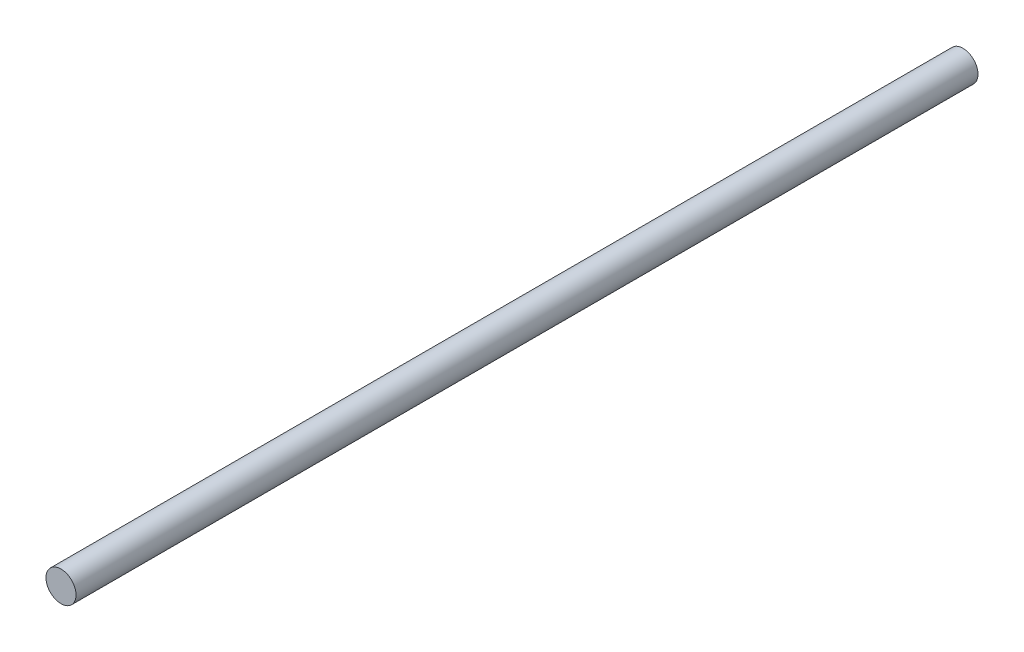
ISO-10303-21;
HEADER;
FILE_DESCRIPTION(('STEP AP214'),'2;1');
FILE_NAME('part.step','',(''),(''),'','','');
FILE_SCHEMA(('AUTOMOTIVE_DESIGN { 1 0 10303 214 1 1 1 1 }'));
ENDSEC;
DATA;
#1=APPLICATION_CONTEXT('core data for automotive mechanical design processes');
#2=APPLICATION_PROTOCOL_DEFINITION('international standard','automotive_design',2000,#1);
#3=PRODUCT_CONTEXT('',#1,'mechanical');
#4=PRODUCT('Part','Part','',(#3));
#5=PRODUCT_RELATED_PRODUCT_CATEGORY('part','',(#4));
#6=PRODUCT_DEFINITION_FORMATION('','',#4);
#7=PRODUCT_DEFINITION_CONTEXT('part definition',#1,'design');
#8=PRODUCT_DEFINITION('design','',#6,#7);
#9=PRODUCT_DEFINITION_SHAPE('','',#8);
#10=(LENGTH_UNIT() NAMED_UNIT(*) SI_UNIT(.MILLI.,.METRE.));
#11=(NAMED_UNIT(*) PLANE_ANGLE_UNIT() SI_UNIT($,.RADIAN.));
#12=(NAMED_UNIT(*) SI_UNIT($,.STERADIAN.) SOLID_ANGLE_UNIT());
#13=UNCERTAINTY_MEASURE_WITH_UNIT(LENGTH_MEASURE(1.E-05),#10,'distance_accuracy_value','');
#14=(GEOMETRIC_REPRESENTATION_CONTEXT(3) GLOBAL_UNCERTAINTY_ASSIGNED_CONTEXT((#13)) GLOBAL_UNIT_ASSIGNED_CONTEXT((#10,
#11,#12)) REPRESENTATION_CONTEXT('',''));
#15=CARTESIAN_POINT('',(0.,0.,0.));
#16=DIRECTION('',(0.,0.,1.));
#17=DIRECTION('',(1.,0.,0.));
#18=AXIS2_PLACEMENT_3D('',#15,#16,#17);
#19=CARTESIAN_POINT('',(0.,0.,95.25));
#20=DIRECTION('',(0.,0.,-1.));
#21=DIRECTION('',(-1.,0.,0.));
#22=AXIS2_PLACEMENT_3D('',#19,#20,#21);
#23=CYLINDRICAL_SURFACE('',#22,1.5875);
#24=CARTESIAN_POINT('',(0.,0.,95.25));
#25=DIRECTION('',(0.,0.,1.));
#26=DIRECTION('',(1.,0.,0.));
#27=AXIS2_PLACEMENT_3D('',#24,#25,#26);
#28=CIRCLE('',#27,1.5875);
#29=CARTESIAN_POINT('',(1.5875,0.,95.25));
#30=VERTEX_POINT('',#29);
#31=EDGE_CURVE('E10',#30,#30,#28,.T.);
#32=ORIENTED_EDGE('',*,*,#31,.F.);
#33=EDGE_LOOP('',(#32));
#34=FACE_BOUND('',#33,.T.);
#35=CARTESIAN_POINT('',(0.,0.,0.));
#36=DIRECTION('',(0.,0.,1.));
#37=DIRECTION('',(1.,0.,0.));
#38=AXIS2_PLACEMENT_3D('',#35,#36,#37);
#39=CIRCLE('',#38,1.5875);
#40=CARTESIAN_POINT('',(1.5875,0.,0.));
#41=VERTEX_POINT('',#40);
#42=EDGE_CURVE('E46',#41,#41,#39,.T.);
#43=ORIENTED_EDGE('',*,*,#42,.T.);
#44=EDGE_LOOP('',(#43));
#45=FACE_BOUND('',#44,.T.);
#46=ADVANCED_FACE('F43',(#34,#45),#23,.T.);
#47=CARTESIAN_POINT('',(0.,0.,95.25));
#48=DIRECTION('',(0.,0.,1.));
#49=DIRECTION('',(1.,0.,0.));
#50=AXIS2_PLACEMENT_3D('',#47,#48,#49);
#51=PLANE('',#50);
#52=ORIENTED_EDGE('',*,*,#31,.T.);
#53=EDGE_LOOP('',(#52));
#54=FACE_BOUND('',#53,.T.);
#55=ADVANCED_FACE('F60',(#54),#51,.T.);
#56=CARTESIAN_POINT('',(0.,0.,0.));
#57=DIRECTION('',(0.,0.,1.));
#58=DIRECTION('',(1.,0.,0.));
#59=AXIS2_PLACEMENT_3D('',#56,#57,#58);
#60=PLANE('',#59);
#61=ORIENTED_EDGE('',*,*,#42,.F.);
#62=EDGE_LOOP('',(#61));
#63=FACE_BOUND('',#62,.T.);
#64=ADVANCED_FACE('F58',(#63),#60,.F.);
#65=CLOSED_SHELL('',(#46,#55,#64));
#66=MANIFOLD_SOLID_BREP('B2',#65);
#67=ADVANCED_BREP_SHAPE_REPRESENTATION('',(#18,#66),#14);
#68=SHAPE_DEFINITION_REPRESENTATION(#9,#67);
ENDSEC;
END-ISO-10303-21;
